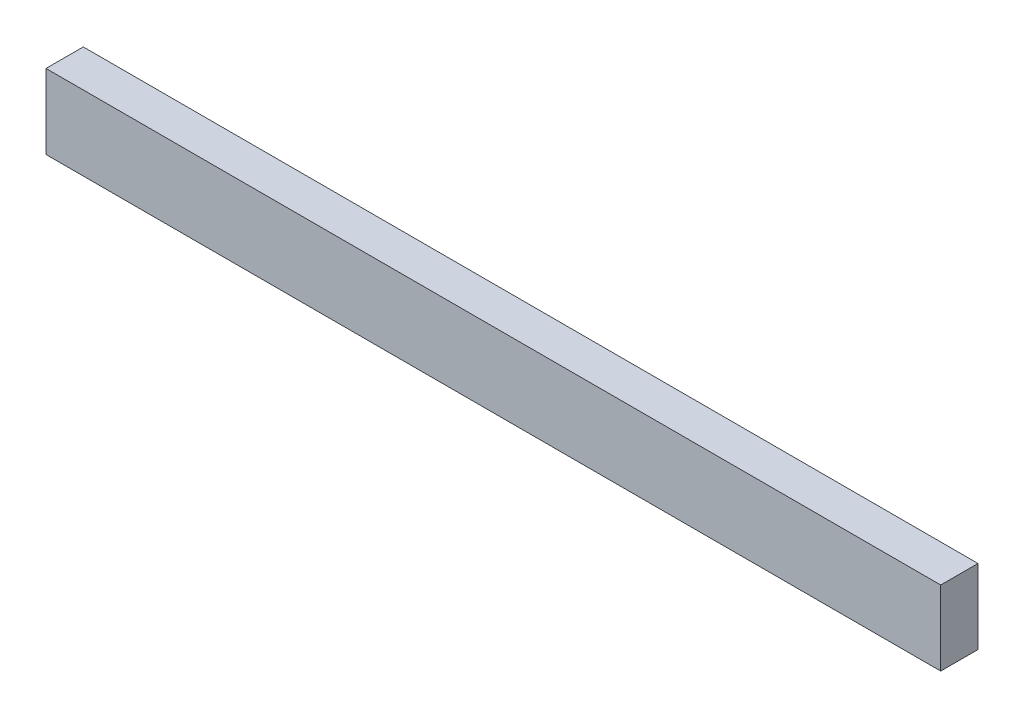
ISO-10303-21;
HEADER;
FILE_DESCRIPTION(('STEP AP214'),'2;1');
FILE_NAME('part.step','',(''),(''),'','','');
FILE_SCHEMA(('AUTOMOTIVE_DESIGN { 1 0 10303 214 1 1 1 1 }'));
ENDSEC;
DATA;
#1=APPLICATION_CONTEXT('core data for automotive mechanical design processes');
#2=APPLICATION_PROTOCOL_DEFINITION('international standard','automotive_design',2000,#1);
#3=PRODUCT_CONTEXT('',#1,'mechanical');
#4=PRODUCT('Part','Part','',(#3));
#5=PRODUCT_RELATED_PRODUCT_CATEGORY('part','',(#4));
#6=PRODUCT_DEFINITION_FORMATION('','',#4);
#7=PRODUCT_DEFINITION_CONTEXT('part definition',#1,'design');
#8=PRODUCT_DEFINITION('design','',#6,#7);
#9=PRODUCT_DEFINITION_SHAPE('','',#8);
#10=(LENGTH_UNIT() NAMED_UNIT(*) SI_UNIT(.MILLI.,.METRE.));
#11=(NAMED_UNIT(*) PLANE_ANGLE_UNIT() SI_UNIT($,.RADIAN.));
#12=(NAMED_UNIT(*) SI_UNIT($,.STERADIAN.) SOLID_ANGLE_UNIT());
#13=UNCERTAINTY_MEASURE_WITH_UNIT(LENGTH_MEASURE(1.E-05),#10,'distance_accuracy_value','');
#14=(GEOMETRIC_REPRESENTATION_CONTEXT(3) GLOBAL_UNCERTAINTY_ASSIGNED_CONTEXT((#13)) GLOBAL_UNIT_ASSIGNED_CONTEXT((#10,
#11,#12)) REPRESENTATION_CONTEXT('',''));
#15=CARTESIAN_POINT('',(0.,0.,0.));
#16=DIRECTION('',(0.,0.,1.));
#17=DIRECTION('',(1.,0.,0.));
#18=AXIS2_PLACEMENT_3D('',#15,#16,#17);
#19=CARTESIAN_POINT('',(609.6,50.8,-25.4));
#20=DIRECTION('',(1.,0.,0.));
#21=DIRECTION('',(0.,0.,-1.));
#22=AXIS2_PLACEMENT_3D('',#19,#20,#21);
#23=PLANE('',#22);
#24=DIRECTION('',(0.,0.,1.));
#25=VECTOR('',#24,1.);
#26=CARTESIAN_POINT('',(609.6,50.8,-25.4));
#27=LINE('',#26,#25);
#28=CARTESIAN_POINT('',(609.6,50.8,-25.4));
#29=VERTEX_POINT('',#28);
#30=CARTESIAN_POINT('',(609.6,50.8,25.4));
#31=VERTEX_POINT('',#30);
#32=EDGE_CURVE('E42',#29,#31,#27,.T.);
#33=ORIENTED_EDGE('',*,*,#32,.T.);
#34=DIRECTION('',(0.,1.,0.));
#35=VECTOR('',#34,1.);
#36=CARTESIAN_POINT('',(609.6,50.8,25.4));
#37=LINE('',#36,#35);
#38=CARTESIAN_POINT('',(609.6,-50.8,25.4));
#39=VERTEX_POINT('',#38);
#40=EDGE_CURVE('E80',#39,#31,#37,.T.);
#41=ORIENTED_EDGE('',*,*,#40,.F.);
#42=DIRECTION('',(0.,0.,1.));
#43=VECTOR('',#42,1.);
#44=CARTESIAN_POINT('',(609.6,-50.8,-25.4));
#45=LINE('',#44,#43);
#46=CARTESIAN_POINT('',(609.6,-50.8,-25.4));
#47=VERTEX_POINT('',#46);
#48=EDGE_CURVE('E11',#47,#39,#45,.T.);
#49=ORIENTED_EDGE('',*,*,#48,.F.);
#50=DIRECTION('',(0.,1.,0.));
#51=VECTOR('',#50,1.);
#52=CARTESIAN_POINT('',(609.6,50.8,-25.4));
#53=LINE('',#52,#51);
#54=EDGE_CURVE('E81',#47,#29,#53,.T.);
#55=ORIENTED_EDGE('',*,*,#54,.T.);
#56=EDGE_LOOP('',(#33,#41,#49,#55));
#57=FACE_BOUND('',#56,.T.);
#58=ADVANCED_FACE('F39',(#57),#23,.T.);
#59=CARTESIAN_POINT('',(-609.6,-50.8,-25.4));
#60=DIRECTION('',(0.,-1.,0.));
#61=DIRECTION('',(0.,0.,-1.));
#62=AXIS2_PLACEMENT_3D('',#59,#60,#61);
#63=PLANE('',#62);
#64=ORIENTED_EDGE('',*,*,#48,.T.);
#65=DIRECTION('',(1.,0.,0.));
#66=VECTOR('',#65,1.);
#67=CARTESIAN_POINT('',(-609.6,-50.8,25.4));
#68=LINE('',#67,#66);
#69=CARTESIAN_POINT('',(-609.6,-50.8,25.4));
#70=VERTEX_POINT('',#69);
#71=EDGE_CURVE('E99',#70,#39,#68,.T.);
#72=ORIENTED_EDGE('',*,*,#71,.F.);
#73=DIRECTION('',(0.,0.,1.));
#74=VECTOR('',#73,1.);
#75=CARTESIAN_POINT('',(-609.6,-50.8,-25.4));
#76=LINE('',#75,#74);
#77=CARTESIAN_POINT('',(-609.6,-50.8,-25.4));
#78=VERTEX_POINT('',#77);
#79=EDGE_CURVE('E48',#78,#70,#76,.T.);
#80=ORIENTED_EDGE('',*,*,#79,.F.);
#81=DIRECTION('',(1.,0.,0.));
#82=VECTOR('',#81,1.);
#83=CARTESIAN_POINT('',(-609.6,-50.8,-25.4));
#84=LINE('',#83,#82);
#85=EDGE_CURVE('E87',#78,#47,#84,.T.);
#86=ORIENTED_EDGE('',*,*,#85,.T.);
#87=EDGE_LOOP('',(#64,#72,#80,#86));
#88=FACE_BOUND('',#87,.T.);
#89=ADVANCED_FACE('F123',(#88),#63,.T.);
#90=CARTESIAN_POINT('',(-609.6,50.8,-25.4));
#91=DIRECTION('',(-1.,0.,0.));
#92=DIRECTION('',(0.,0.,1.));
#93=AXIS2_PLACEMENT_3D('',#90,#91,#92);
#94=PLANE('',#93);
#95=ORIENTED_EDGE('',*,*,#79,.T.);
#96=DIRECTION('',(0.,-1.,0.));
#97=VECTOR('',#96,1.);
#98=CARTESIAN_POINT('',(-609.6,50.8,25.4));
#99=LINE('',#98,#97);
#100=CARTESIAN_POINT('',(-609.6,50.8,25.4));
#101=VERTEX_POINT('',#100);
#102=EDGE_CURVE('E95',#101,#70,#99,.T.);
#103=ORIENTED_EDGE('',*,*,#102,.F.);
#104=DIRECTION('',(0.,0.,1.));
#105=VECTOR('',#104,1.);
#106=CARTESIAN_POINT('',(-609.6,50.8,-25.4));
#107=LINE('',#106,#105);
#108=CARTESIAN_POINT('',(-609.6,50.8,-25.4));
#109=VERTEX_POINT('',#108);
#110=EDGE_CURVE('E86',#109,#101,#107,.T.);
#111=ORIENTED_EDGE('',*,*,#110,.F.);
#112=DIRECTION('',(0.,-1.,0.));
#113=VECTOR('',#112,1.);
#114=CARTESIAN_POINT('',(-609.6,50.8,-25.4));
#115=LINE('',#114,#113);
#116=EDGE_CURVE('E112',#109,#78,#115,.T.);
#117=ORIENTED_EDGE('',*,*,#116,.T.);
#118=EDGE_LOOP('',(#95,#103,#111,#117));
#119=FACE_BOUND('',#118,.T.);
#120=ADVANCED_FACE('F120',(#119),#94,.T.);
#121=CARTESIAN_POINT('',(-609.6,50.8,-25.4));
#122=DIRECTION('',(0.,1.,0.));
#123=DIRECTION('',(0.,0.,1.));
#124=AXIS2_PLACEMENT_3D('',#121,#122,#123);
#125=PLANE('',#124);
#126=ORIENTED_EDGE('',*,*,#110,.T.);
#127=DIRECTION('',(-1.,0.,0.));
#128=VECTOR('',#127,1.);
#129=CARTESIAN_POINT('',(-609.6,50.8,25.4));
#130=LINE('',#129,#128);
#131=EDGE_CURVE('E89',#31,#101,#130,.T.);
#132=ORIENTED_EDGE('',*,*,#131,.F.);
#133=ORIENTED_EDGE('',*,*,#32,.F.);
#134=DIRECTION('',(-1.,0.,0.));
#135=VECTOR('',#134,1.);
#136=CARTESIAN_POINT('',(-609.6,50.8,-25.4));
#137=LINE('',#136,#135);
#138=EDGE_CURVE('E109',#29,#109,#137,.T.);
#139=ORIENTED_EDGE('',*,*,#138,.T.);
#140=EDGE_LOOP('',(#126,#132,#133,#139));
#141=FACE_BOUND('',#140,.T.);
#142=ADVANCED_FACE('F90',(#141),#125,.T.);
#143=CARTESIAN_POINT('',(0.,0.,-25.4));
#144=DIRECTION('',(0.,0.,1.));
#145=DIRECTION('',(1.,0.,0.));
#146=AXIS2_PLACEMENT_3D('',#143,#144,#145);
#147=PLANE('',#146);
#148=ORIENTED_EDGE('',*,*,#54,.F.);
#149=ORIENTED_EDGE('',*,*,#85,.F.);
#150=ORIENTED_EDGE('',*,*,#116,.F.);
#151=ORIENTED_EDGE('',*,*,#138,.F.);
#152=EDGE_LOOP('',(#148,#149,#150,#151));
#153=FACE_BOUND('',#152,.T.);
#154=ADVANCED_FACE('F125',(#153),#147,.F.);
#155=CARTESIAN_POINT('',(0.,0.,25.4));
#156=DIRECTION('',(0.,0.,1.));
#157=DIRECTION('',(1.,0.,0.));
#158=AXIS2_PLACEMENT_3D('',#155,#156,#157);
#159=PLANE('',#158);
#160=ORIENTED_EDGE('',*,*,#40,.T.);
#161=ORIENTED_EDGE('',*,*,#131,.T.);
#162=ORIENTED_EDGE('',*,*,#102,.T.);
#163=ORIENTED_EDGE('',*,*,#71,.T.);
#164=EDGE_LOOP('',(#160,#161,#162,#163));
#165=FACE_BOUND('',#164,.T.);
#166=ADVANCED_FACE('F98',(#165),#159,.T.);
#167=CLOSED_SHELL('',(#58,#89,#120,#142,#154,#166));
#168=MANIFOLD_SOLID_BREP('B2',#167);
#169=ADVANCED_BREP_SHAPE_REPRESENTATION('',(#18,#168),#14);
#170=SHAPE_DEFINITION_REPRESENTATION(#9,#169);
ENDSEC;
END-ISO-10303-21;
